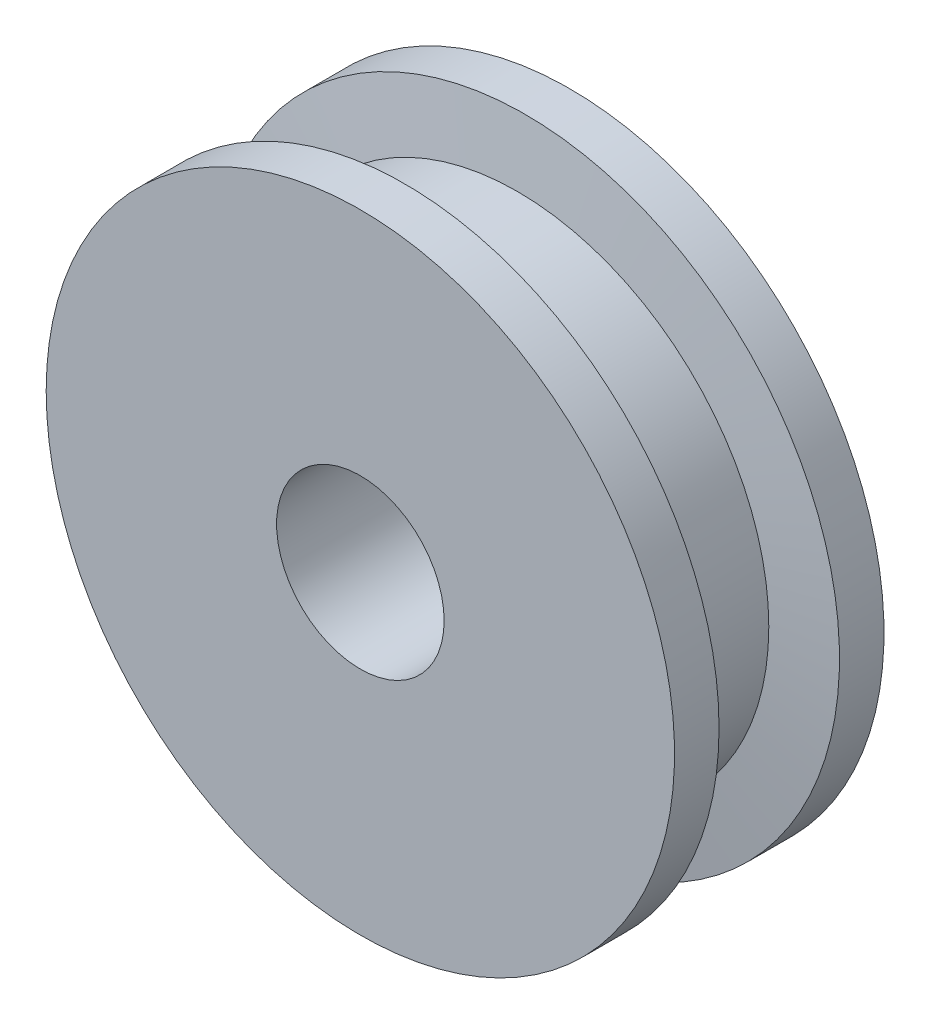
ISO-10303-21;
HEADER;
FILE_DESCRIPTION(('STEP AP214'),'2;1');
FILE_NAME('part.step','',(''),(''),'','','');
FILE_SCHEMA(('AUTOMOTIVE_DESIGN { 1 0 10303 214 1 1 1 1 }'));
ENDSEC;
DATA;
#1=APPLICATION_CONTEXT('core data for automotive mechanical design processes');
#2=APPLICATION_PROTOCOL_DEFINITION('international standard','automotive_design',2000,#1);
#3=PRODUCT_CONTEXT('',#1,'mechanical');
#4=PRODUCT('Part','Part','',(#3));
#5=PRODUCT_RELATED_PRODUCT_CATEGORY('part','',(#4));
#6=PRODUCT_DEFINITION_FORMATION('','',#4);
#7=PRODUCT_DEFINITION_CONTEXT('part definition',#1,'design');
#8=PRODUCT_DEFINITION('design','',#6,#7);
#9=PRODUCT_DEFINITION_SHAPE('','',#8);
#10=(LENGTH_UNIT() NAMED_UNIT(*) SI_UNIT(.MILLI.,.METRE.));
#11=(NAMED_UNIT(*) PLANE_ANGLE_UNIT() SI_UNIT($,.RADIAN.));
#12=(NAMED_UNIT(*) SI_UNIT($,.STERADIAN.) SOLID_ANGLE_UNIT());
#13=UNCERTAINTY_MEASURE_WITH_UNIT(LENGTH_MEASURE(1.E-05),#10,'distance_accuracy_value','');
#14=(GEOMETRIC_REPRESENTATION_CONTEXT(3) GLOBAL_UNCERTAINTY_ASSIGNED_CONTEXT((#13)) GLOBAL_UNIT_ASSIGNED_CONTEXT((#10,
#11,#12)) REPRESENTATION_CONTEXT('',''));
#15=CARTESIAN_POINT('',(0.,0.,0.));
#16=DIRECTION('',(0.,0.,1.));
#17=DIRECTION('',(1.,0.,0.));
#18=AXIS2_PLACEMENT_3D('',#15,#16,#17);
#19=CARTESIAN_POINT('',(0.,0.,7.875));
#20=DIRECTION('',(0.,0.,1.));
#21=DIRECTION('',(1.,0.,0.));
#22=AXIS2_PLACEMENT_3D('',#19,#20,#21);
#23=CONICAL_SURFACE('',#22,15.,1.44644133224814);
#24=CARTESIAN_POINT('',(0.,0.,7.5));
#25=DIRECTION('',(0.,0.,1.));
#26=DIRECTION('',(1.,0.,0.));
#27=AXIS2_PLACEMENT_3D('',#24,#25,#26);
#28=CIRCLE('',#27,12.);
#29=CARTESIAN_POINT('',(12.,0.,7.5));
#30=VERTEX_POINT('',#29);
#31=EDGE_CURVE('E53',#30,#30,#28,.F.);
#32=ORIENTED_EDGE('',*,*,#31,.F.);
#33=EDGE_LOOP('',(#32));
#34=FACE_BOUND('',#33,.T.);
#35=CARTESIAN_POINT('',(0.,0.,7.875));
#36=DIRECTION('',(0.,0.,-1.));
#37=DIRECTION('',(-1.,0.,0.));
#38=AXIS2_PLACEMENT_3D('',#35,#36,#37);
#39=CIRCLE('',#38,15.);
#40=CARTESIAN_POINT('',(-15.,0.,7.875));
#41=VERTEX_POINT('',#40);
#42=EDGE_CURVE('E35',#41,#41,#39,.F.);
#43=ORIENTED_EDGE('',*,*,#42,.F.);
#44=EDGE_LOOP('',(#43));
#45=FACE_BOUND('',#44,.T.);
#46=ADVANCED_FACE('F15',(#34,#45),#23,.T.);
#47=CARTESIAN_POINT('',(0.,0.,10.));
#48=DIRECTION('',(0.,0.,-1.));
#49=DIRECTION('',(-1.,0.,0.));
#50=AXIS2_PLACEMENT_3D('',#47,#48,#49);
#51=CYLINDRICAL_SURFACE('',#50,15.);
#52=ORIENTED_EDGE('',*,*,#42,.T.);
#53=EDGE_LOOP('',(#52));
#54=FACE_BOUND('',#53,.T.);
#55=CARTESIAN_POINT('',(0.,0.,10.));
#56=DIRECTION('',(0.,0.,-1.));
#57=DIRECTION('',(-1.,0.,0.));
#58=AXIS2_PLACEMENT_3D('',#55,#56,#57);
#59=CIRCLE('',#58,15.);
#60=CARTESIAN_POINT('',(-15.,0.,10.));
#61=VERTEX_POINT('',#60);
#62=EDGE_CURVE('E18',#61,#61,#59,.F.);
#63=ORIENTED_EDGE('',*,*,#62,.F.);
#64=EDGE_LOOP('',(#63));
#65=FACE_BOUND('',#64,.T.);
#66=ADVANCED_FACE('F60',(#54,#65),#51,.T.);
#67=CARTESIAN_POINT('',(0.,0.,10.));
#68=DIRECTION('',(0.,0.,1.));
#69=DIRECTION('',(1.,0.,0.));
#70=AXIS2_PLACEMENT_3D('',#67,#68,#69);
#71=CYLINDRICAL_SURFACE('',#70,12.);
#72=CARTESIAN_POINT('',(0.,0.,2.5));
#73=DIRECTION('',(0.,0.,-1.));
#74=DIRECTION('',(-1.,0.,0.));
#75=AXIS2_PLACEMENT_3D('',#72,#73,#74);
#76=CIRCLE('',#75,12.);
#77=CARTESIAN_POINT('',(-12.,0.,2.5));
#78=VERTEX_POINT('',#77);
#79=EDGE_CURVE('E40',#78,#78,#76,.T.);
#80=ORIENTED_EDGE('',*,*,#79,.F.);
#81=EDGE_LOOP('',(#80));
#82=FACE_BOUND('',#81,.T.);
#83=ORIENTED_EDGE('',*,*,#31,.T.);
#84=EDGE_LOOP('',(#83));
#85=FACE_BOUND('',#84,.T.);
#86=ADVANCED_FACE('F69',(#82,#85),#71,.T.);
#87=CARTESIAN_POINT('',(0.,0.,10.));
#88=DIRECTION('',(0.,0.,1.));
#89=DIRECTION('',(1.,0.,0.));
#90=AXIS2_PLACEMENT_3D('',#87,#88,#89);
#91=PLANE('',#90);
#92=ORIENTED_EDGE('',*,*,#62,.T.);
#93=EDGE_LOOP('',(#92));
#94=FACE_BOUND('',#93,.T.);
#95=CARTESIAN_POINT('',(0.,0.,10.));
#96=DIRECTION('',(0.,0.,1.));
#97=DIRECTION('',(1.,0.,0.));
#98=AXIS2_PLACEMENT_3D('',#95,#96,#97);
#99=CIRCLE('',#98,4.);
#100=CARTESIAN_POINT('',(4.,0.,10.));
#101=VERTEX_POINT('',#100);
#102=EDGE_CURVE('E37',#101,#101,#99,.F.);
#103=ORIENTED_EDGE('',*,*,#102,.T.);
#104=EDGE_LOOP('',(#103));
#105=FACE_BOUND('',#104,.T.);
#106=ADVANCED_FACE('F89',(#94,#105),#91,.T.);
#107=CARTESIAN_POINT('',(0.,0.,2.125));
#108=DIRECTION('',(0.,0.,-1.));
#109=DIRECTION('',(0.,1.,0.));
#110=AXIS2_PLACEMENT_3D('',#107,#108,#109);
#111=CONICAL_SURFACE('',#110,15.,1.44644133224814);
#112=ORIENTED_EDGE('',*,*,#79,.T.);
#113=EDGE_LOOP('',(#112));
#114=FACE_BOUND('',#113,.T.);
#115=CARTESIAN_POINT('',(0.,0.,2.125));
#116=DIRECTION('',(0.,0.,-1.));
#117=DIRECTION('',(-1.,0.,0.));
#118=AXIS2_PLACEMENT_3D('',#115,#116,#117);
#119=CIRCLE('',#118,15.);
#120=CARTESIAN_POINT('',(-15.,0.,2.125));
#121=VERTEX_POINT('',#120);
#122=EDGE_CURVE('E32',#121,#121,#119,.T.);
#123=ORIENTED_EDGE('',*,*,#122,.F.);
#124=EDGE_LOOP('',(#123));
#125=FACE_BOUND('',#124,.T.);
#126=ADVANCED_FACE('F85',(#114,#125),#111,.T.);
#127=CARTESIAN_POINT('',(0.,0.,0.));
#128=DIRECTION('',(0.,0.,1.));
#129=DIRECTION('',(1.,0.,0.));
#130=AXIS2_PLACEMENT_3D('',#127,#128,#129);
#131=CYLINDRICAL_SURFACE('',#130,4.);
#132=CARTESIAN_POINT('',(0.,0.,0.));
#133=DIRECTION('',(0.,0.,1.));
#134=DIRECTION('',(1.,0.,0.));
#135=AXIS2_PLACEMENT_3D('',#132,#133,#134);
#136=CIRCLE('',#135,4.);
#137=CARTESIAN_POINT('',(4.,0.,0.));
#138=VERTEX_POINT('',#137);
#139=EDGE_CURVE('E23',#138,#138,#136,.F.);
#140=ORIENTED_EDGE('',*,*,#139,.T.);
#141=EDGE_LOOP('',(#140));
#142=FACE_BOUND('',#141,.T.);
#143=ORIENTED_EDGE('',*,*,#102,.F.);
#144=EDGE_LOOP('',(#143));
#145=FACE_BOUND('',#144,.T.);
#146=ADVANCED_FACE('F78',(#142,#145),#131,.F.);
#147=CARTESIAN_POINT('',(0.,0.,10.));
#148=DIRECTION('',(0.,0.,-1.));
#149=DIRECTION('',(-1.,0.,0.));
#150=AXIS2_PLACEMENT_3D('',#147,#148,#149);
#151=CYLINDRICAL_SURFACE('',#150,15.);
#152=ORIENTED_EDGE('',*,*,#122,.T.);
#153=EDGE_LOOP('',(#152));
#154=FACE_BOUND('',#153,.T.);
#155=CARTESIAN_POINT('',(0.,0.,0.));
#156=DIRECTION('',(0.,0.,-1.));
#157=DIRECTION('',(-1.,0.,0.));
#158=AXIS2_PLACEMENT_3D('',#155,#156,#157);
#159=CIRCLE('',#158,15.);
#160=CARTESIAN_POINT('',(-15.,0.,0.));
#161=VERTEX_POINT('',#160);
#162=EDGE_CURVE('E10',#161,#161,#159,.F.);
#163=ORIENTED_EDGE('',*,*,#162,.T.);
#164=EDGE_LOOP('',(#163));
#165=FACE_BOUND('',#164,.T.);
#166=ADVANCED_FACE('F72',(#154,#165),#151,.T.);
#167=CARTESIAN_POINT('',(0.,0.,0.));
#168=DIRECTION('',(0.,0.,1.));
#169=DIRECTION('',(1.,0.,0.));
#170=AXIS2_PLACEMENT_3D('',#167,#168,#169);
#171=PLANE('',#170);
#172=ORIENTED_EDGE('',*,*,#162,.F.);
#173=EDGE_LOOP('',(#172));
#174=FACE_BOUND('',#173,.T.);
#175=ORIENTED_EDGE('',*,*,#139,.F.);
#176=EDGE_LOOP('',(#175));
#177=FACE_BOUND('',#176,.T.);
#178=ADVANCED_FACE('F70',(#174,#177),#171,.F.);
#179=CLOSED_SHELL('',(#46,#66,#86,#106,#126,#146,#166,#178));
#180=MANIFOLD_SOLID_BREP('B1',#179);
#181=ADVANCED_BREP_SHAPE_REPRESENTATION('',(#18,#180),#14);
#182=SHAPE_DEFINITION_REPRESENTATION(#9,#181);
ENDSEC;
END-ISO-10303-21;
